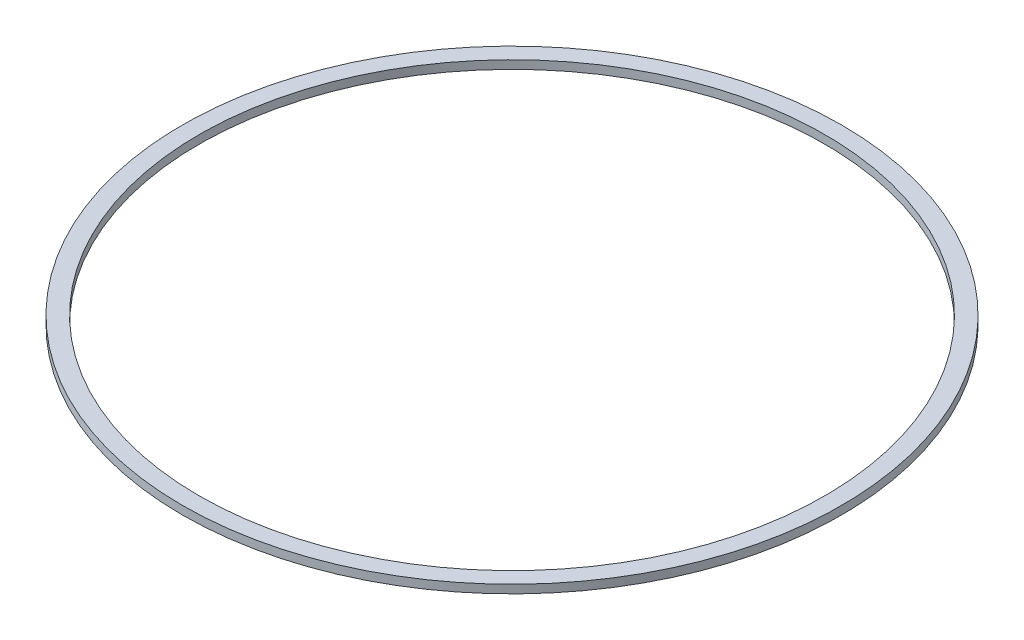
ISO-10303-21;
HEADER;
FILE_DESCRIPTION(('STEP AP214'),'2;1');
FILE_NAME('part.step','',(''),(''),'','','');
FILE_SCHEMA(('AUTOMOTIVE_DESIGN { 1 0 10303 214 1 1 1 1 }'));
ENDSEC;
DATA;
#1=APPLICATION_CONTEXT('core data for automotive mechanical design processes');
#2=APPLICATION_PROTOCOL_DEFINITION('international standard','automotive_design',2000,#1);
#3=PRODUCT_CONTEXT('',#1,'mechanical');
#4=PRODUCT('Part','Part','',(#3));
#5=PRODUCT_RELATED_PRODUCT_CATEGORY('part','',(#4));
#6=PRODUCT_DEFINITION_FORMATION('','',#4);
#7=PRODUCT_DEFINITION_CONTEXT('part definition',#1,'design');
#8=PRODUCT_DEFINITION('design','',#6,#7);
#9=PRODUCT_DEFINITION_SHAPE('','',#8);
#10=(LENGTH_UNIT() NAMED_UNIT(*) SI_UNIT(.MILLI.,.METRE.));
#11=(NAMED_UNIT(*) PLANE_ANGLE_UNIT() SI_UNIT($,.RADIAN.));
#12=(NAMED_UNIT(*) SI_UNIT($,.STERADIAN.) SOLID_ANGLE_UNIT());
#13=UNCERTAINTY_MEASURE_WITH_UNIT(LENGTH_MEASURE(1.E-05),#10,'distance_accuracy_value','');
#14=(GEOMETRIC_REPRESENTATION_CONTEXT(3) GLOBAL_UNCERTAINTY_ASSIGNED_CONTEXT((#13)) GLOBAL_UNIT_ASSIGNED_CONTEXT((#10,
#11,#12)) REPRESENTATION_CONTEXT('',''));
#15=CARTESIAN_POINT('',(0.,0.,0.));
#16=DIRECTION('',(0.,0.,1.));
#17=DIRECTION('',(1.,0.,0.));
#18=AXIS2_PLACEMENT_3D('',#15,#16,#17);
#19=CARTESIAN_POINT('',(0.,6.35,0.));
#20=DIRECTION('',(0.,1.,0.));
#21=DIRECTION('',(0.,0.,1.));
#22=AXIS2_PLACEMENT_3D('',#19,#20,#21);
#23=PLANE('',#22);
#24=CARTESIAN_POINT('',(0.,6.35,0.));
#25=DIRECTION('',(0.,1.,0.));
#26=DIRECTION('',(0.,0.,1.));
#27=AXIS2_PLACEMENT_3D('',#24,#25,#26);
#28=CIRCLE('',#27,250.825);
#29=CARTESIAN_POINT('',(0.,6.35,250.825));
#30=VERTEX_POINT('',#29);
#31=EDGE_CURVE('E10',#30,#30,#28,.T.);
#32=ORIENTED_EDGE('',*,*,#31,.T.);
#33=EDGE_LOOP('',(#32));
#34=FACE_BOUND('',#33,.T.);
#35=CARTESIAN_POINT('',(0.,6.35,0.));
#36=DIRECTION('',(0.,1.,0.));
#37=DIRECTION('',(0.,0.,1.));
#38=AXIS2_PLACEMENT_3D('',#35,#36,#37);
#39=CIRCLE('',#38,238.125);
#40=CARTESIAN_POINT('',(0.,6.35,238.125));
#41=VERTEX_POINT('',#40);
#42=EDGE_CURVE('E42',#41,#41,#39,.T.);
#43=ORIENTED_EDGE('',*,*,#42,.F.);
#44=EDGE_LOOP('',(#43));
#45=FACE_BOUND('',#44,.T.);
#46=ADVANCED_FACE('F31',(#34,#45),#23,.T.);
#47=CARTESIAN_POINT('',(0.,0.,0.));
#48=DIRECTION('',(0.,1.,0.));
#49=DIRECTION('',(0.,0.,1.));
#50=AXIS2_PLACEMENT_3D('',#47,#48,#49);
#51=PLANE('',#50);
#52=CARTESIAN_POINT('',(0.,0.,0.));
#53=DIRECTION('',(0.,1.,0.));
#54=DIRECTION('',(0.,0.,1.));
#55=AXIS2_PLACEMENT_3D('',#52,#53,#54);
#56=CIRCLE('',#55,250.825);
#57=CARTESIAN_POINT('',(0.,0.,250.825));
#58=VERTEX_POINT('',#57);
#59=EDGE_CURVE('E35',#58,#58,#56,.T.);
#60=ORIENTED_EDGE('',*,*,#59,.F.);
#61=EDGE_LOOP('',(#60));
#62=FACE_BOUND('',#61,.T.);
#63=CARTESIAN_POINT('',(0.,0.,0.));
#64=DIRECTION('',(0.,1.,0.));
#65=DIRECTION('',(0.,0.,1.));
#66=AXIS2_PLACEMENT_3D('',#63,#64,#65);
#67=CIRCLE('',#66,238.125);
#68=CARTESIAN_POINT('',(0.,0.,238.125));
#69=VERTEX_POINT('',#68);
#70=EDGE_CURVE('E44',#69,#69,#67,.T.);
#71=ORIENTED_EDGE('',*,*,#70,.T.);
#72=EDGE_LOOP('',(#71));
#73=FACE_BOUND('',#72,.T.);
#74=ADVANCED_FACE('F54',(#62,#73),#51,.F.);
#75=CARTESIAN_POINT('',(0.,6.35,0.));
#76=DIRECTION('',(0.,-1.,0.));
#77=DIRECTION('',(0.,0.,-1.));
#78=AXIS2_PLACEMENT_3D('',#75,#76,#77);
#79=CYLINDRICAL_SURFACE('',#78,250.825);
#80=ORIENTED_EDGE('',*,*,#31,.F.);
#81=EDGE_LOOP('',(#80));
#82=FACE_BOUND('',#81,.T.);
#83=ORIENTED_EDGE('',*,*,#59,.T.);
#84=EDGE_LOOP('',(#83));
#85=FACE_BOUND('',#84,.T.);
#86=ADVANCED_FACE('F33',(#82,#85),#79,.T.);
#87=CARTESIAN_POINT('',(0.,6.35,0.));
#88=DIRECTION('',(0.,-1.,0.));
#89=DIRECTION('',(0.,0.,-1.));
#90=AXIS2_PLACEMENT_3D('',#87,#88,#89);
#91=CYLINDRICAL_SURFACE('',#90,238.125);
#92=ORIENTED_EDGE('',*,*,#42,.T.);
#93=EDGE_LOOP('',(#92));
#94=FACE_BOUND('',#93,.T.);
#95=ORIENTED_EDGE('',*,*,#70,.F.);
#96=EDGE_LOOP('',(#95));
#97=FACE_BOUND('',#96,.T.);
#98=ADVANCED_FACE('F50',(#94,#97),#91,.F.);
#99=CLOSED_SHELL('',(#46,#74,#86,#98));
#100=MANIFOLD_SOLID_BREP('B2',#99);
#101=ADVANCED_BREP_SHAPE_REPRESENTATION('',(#18,#100),#14);
#102=SHAPE_DEFINITION_REPRESENTATION(#9,#101);
ENDSEC;
END-ISO-10303-21;
